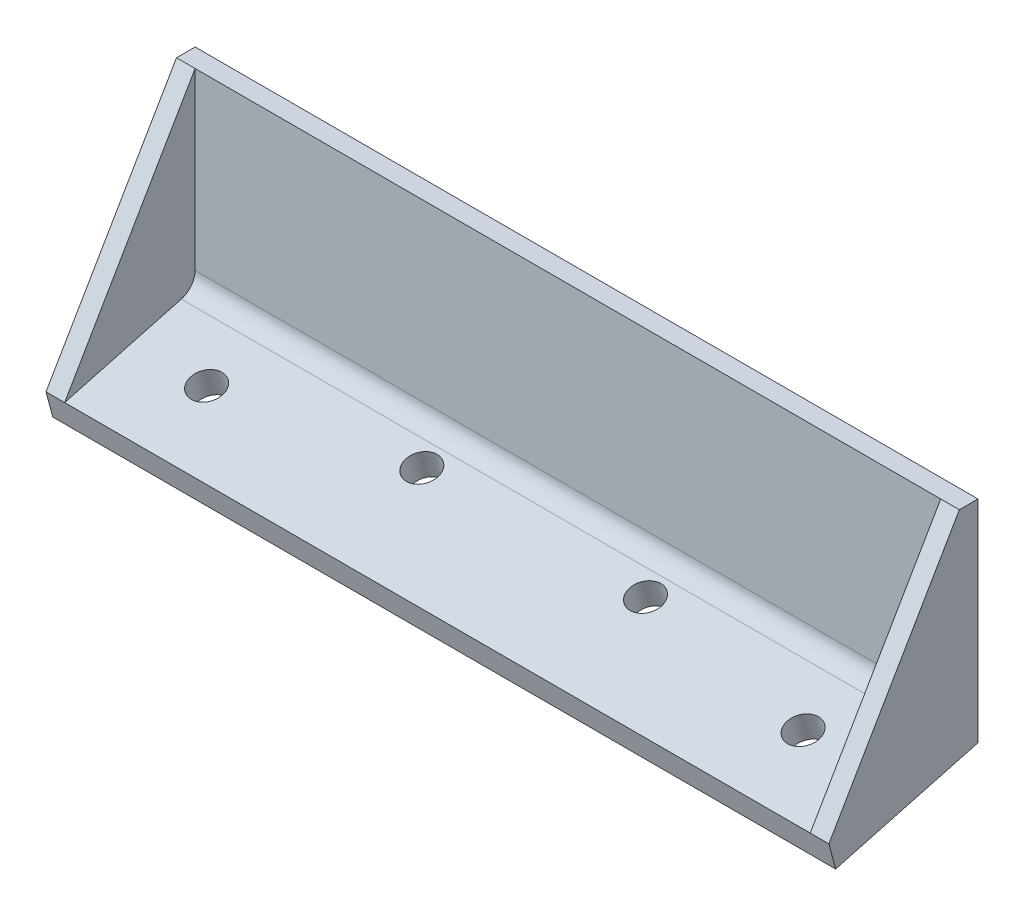
ISO-10303-21;
HEADER;
FILE_DESCRIPTION(('STEP AP214'),'2;1');
FILE_NAME('part.step','',(''),(''),'','','');
FILE_SCHEMA(('AUTOMOTIVE_DESIGN { 1 0 10303 214 1 1 1 1 }'));
ENDSEC;
DATA;
#1=APPLICATION_CONTEXT('core data for automotive mechanical design processes');
#2=APPLICATION_PROTOCOL_DEFINITION('international standard','automotive_design',2000,#1);
#3=PRODUCT_CONTEXT('',#1,'mechanical');
#4=PRODUCT('Part','Part','',(#3));
#5=PRODUCT_RELATED_PRODUCT_CATEGORY('part','',(#4));
#6=PRODUCT_DEFINITION_FORMATION('','',#4);
#7=PRODUCT_DEFINITION_CONTEXT('part definition',#1,'design');
#8=PRODUCT_DEFINITION('design','',#6,#7);
#9=PRODUCT_DEFINITION_SHAPE('','',#8);
#10=(LENGTH_UNIT() NAMED_UNIT(*) SI_UNIT(.MILLI.,.METRE.));
#11=(NAMED_UNIT(*) PLANE_ANGLE_UNIT() SI_UNIT($,.RADIAN.));
#12=(NAMED_UNIT(*) SI_UNIT($,.STERADIAN.) SOLID_ANGLE_UNIT());
#13=UNCERTAINTY_MEASURE_WITH_UNIT(LENGTH_MEASURE(1.E-05),#10,'distance_accuracy_value','');
#14=(GEOMETRIC_REPRESENTATION_CONTEXT(3) GLOBAL_UNCERTAINTY_ASSIGNED_CONTEXT((#13)) GLOBAL_UNIT_ASSIGNED_CONTEXT((#10,
#11,#12)) REPRESENTATION_CONTEXT('',''));
#15=CARTESIAN_POINT('',(0.,0.,0.));
#16=DIRECTION('',(0.,0.,1.));
#17=DIRECTION('',(1.,0.,0.));
#18=AXIS2_PLACEMENT_3D('',#15,#16,#17);
#19=CARTESIAN_POINT('',(160.,30.,-31.93));
#20=DIRECTION('',(0.,1.,0.));
#21=DIRECTION('',(0.,0.,1.));
#22=AXIS2_PLACEMENT_3D('',#19,#20,#21);
#23=PLANE('',#22);
#24=DIRECTION('',(1.,0.,0.));
#25=VECTOR('',#24,1.);
#26=CARTESIAN_POINT('',(160.,30.,52.));
#27=LINE('',#26,#25);
#28=CARTESIAN_POINT('',(-52.,30.,52.));
#29=VERTEX_POINT('',#28);
#30=CARTESIAN_POINT('',(158.,30.,52.));
#31=VERTEX_POINT('',#30);
#32=EDGE_CURVE('E118',#29,#31,#27,.T.);
#33=ORIENTED_EDGE('',*,*,#32,.F.);
#34=DIRECTION('',(0.,0.,1.));
#35=VECTOR('',#34,1.);
#36=CARTESIAN_POINT('',(-52.,30.,0.));
#37=LINE('',#36,#35);
#38=CARTESIAN_POINT('',(-52.,30.,57.));
#39=VERTEX_POINT('',#38);
#40=EDGE_CURVE('E128',#29,#39,#37,.T.);
#41=ORIENTED_EDGE('',*,*,#40,.T.);
#42=DIRECTION('',(1.,0.,0.));
#43=VECTOR('',#42,1.);
#44=CARTESIAN_POINT('',(-52.,30.,57.));
#45=LINE('',#44,#43);
#46=CARTESIAN_POINT('',(-47.,30.,57.));
#47=VERTEX_POINT('',#46);
#48=EDGE_CURVE('E181',#39,#47,#45,.T.);
#49=ORIENTED_EDGE('',*,*,#48,.T.);
#50=CARTESIAN_POINT('',(153.,30.,57.));
#51=VERTEX_POINT('',#50);
#52=EDGE_CURVE('E183',#47,#51,#45,.T.);
#53=ORIENTED_EDGE('',*,*,#52,.T.);
#54=DIRECTION('',(1.,0.,0.));
#55=VECTOR('',#54,1.);
#56=CARTESIAN_POINT('',(153.,30.,57.));
#57=LINE('',#56,#55);
#58=CARTESIAN_POINT('',(158.,30.,57.));
#59=VERTEX_POINT('',#58);
#60=EDGE_CURVE('E162',#51,#59,#57,.T.);
#61=ORIENTED_EDGE('',*,*,#60,.T.);
#62=DIRECTION('',(0.,0.,1.));
#63=VECTOR('',#62,1.);
#64=CARTESIAN_POINT('',(158.,30.,0.));
#65=LINE('',#64,#63);
#66=EDGE_CURVE('E131',#31,#59,#65,.T.);
#67=ORIENTED_EDGE('',*,*,#66,.F.);
#68=EDGE_LOOP('',(#33,#41,#49,#53,#61,#67));
#69=FACE_BOUND('',#68,.T.);
#70=ADVANCED_FACE('F43',(#69),#23,.T.);
#71=CARTESIAN_POINT('',(158.,0.,0.));
#72=DIRECTION('',(-1.,0.,0.));
#73=DIRECTION('',(0.,0.,1.));
#74=AXIS2_PLACEMENT_3D('',#71,#72,#73);
#75=PLANE('',#74);
#76=DIRECTION('',(0.,1.,0.));
#77=VECTOR('',#76,1.);
#78=CARTESIAN_POINT('',(158.,-241.069901587953,52.));
#79=LINE('',#78,#77);
#80=CARTESIAN_POINT('',(158.,-26.6354645502457,52.));
#81=VERTEX_POINT('',#80);
#82=EDGE_CURVE('E147',#81,#31,#79,.T.);
#83=ORIENTED_EDGE('',*,*,#82,.T.);
#84=ORIENTED_EDGE('',*,*,#66,.T.);
#85=DIRECTION('',(0.,-0.864167385121237,0.503204461916549));
#86=VECTOR('',#85,1.);
#87=CARTESIAN_POINT('',(158.,30.,57.));
#88=LINE('',#87,#86);
#89=CARTESIAN_POINT('',(158.,-30.10649898462,92.));
#90=VERTEX_POINT('',#89);
#91=EDGE_CURVE('E159',#59,#90,#88,.T.);
#92=ORIENTED_EDGE('',*,*,#91,.T.);
#93=DIRECTION('',(0.,-0.965925826289069,-0.258819045102518));
#94=VECTOR('',#93,1.);
#95=CARTESIAN_POINT('',(158.,-36.8679797686435,90.1882666842824));
#96=LINE('',#95,#94);
#97=CARTESIAN_POINT('',(158.,-36.8679797686435,90.1882666842824));
#98=VERTEX_POINT('',#97);
#99=EDGE_CURVE('E212',#90,#98,#96,.T.);
#100=ORIENTED_EDGE('',*,*,#99,.T.);
#101=DIRECTION('',(0.,0.258819045102521,-0.965925826289068));
#102=VECTOR('',#101,1.);
#103=CARTESIAN_POINT('',(158.,-40.9998481086648,105.608609259427));
#104=LINE('',#103,#102);
#105=EDGE_CURVE('E182',#98,#81,#104,.T.);
#106=ORIENTED_EDGE('',*,*,#105,.T.);
#107=EDGE_LOOP('',(#83,#84,#92,#100,#106));
#108=FACE_BOUND('',#107,.T.);
#109=ADVANCED_FACE('F234',(#108),#75,.F.);
#110=CARTESIAN_POINT('',(-52.,0.,0.));
#111=DIRECTION('',(-1.,0.,0.));
#112=DIRECTION('',(0.,0.,1.));
#113=AXIS2_PLACEMENT_3D('',#110,#111,#112);
#114=PLANE('',#113);
#115=ORIENTED_EDGE('',*,*,#40,.F.);
#116=DIRECTION('',(0.,1.,0.));
#117=VECTOR('',#116,1.);
#118=CARTESIAN_POINT('',(-52.,-241.069901587953,52.));
#119=LINE('',#118,#117);
#120=CARTESIAN_POINT('',(-52.,-26.6354645502457,52.));
#121=VERTEX_POINT('',#120);
#122=EDGE_CURVE('E114',#121,#29,#119,.T.);
#123=ORIENTED_EDGE('',*,*,#122,.F.);
#124=DIRECTION('',(0.,-0.258819045102521,0.965925826289068));
#125=VECTOR('',#124,1.);
#126=CARTESIAN_POINT('',(-51.9999999999999,-40.9998481086648,105.608609259427));
#127=LINE('',#126,#125);
#128=CARTESIAN_POINT('',(-52.,-36.8679797686435,90.1882666842824));
#129=VERTEX_POINT('',#128);
#130=EDGE_CURVE('E124',#121,#129,#127,.T.);
#131=ORIENTED_EDGE('',*,*,#130,.T.);
#132=DIRECTION('',(0.,0.965925826289069,0.258819045102519));
#133=VECTOR('',#132,1.);
#134=CARTESIAN_POINT('',(-52.,-36.8679797686435,90.1882666842824));
#135=LINE('',#134,#133);
#136=CARTESIAN_POINT('',(-52.,-30.10649898462,92.));
#137=VERTEX_POINT('',#136);
#138=EDGE_CURVE('E211',#129,#137,#135,.T.);
#139=ORIENTED_EDGE('',*,*,#138,.T.);
#140=DIRECTION('',(0.,0.864167385121237,-0.503204461916549));
#141=VECTOR('',#140,1.);
#142=CARTESIAN_POINT('',(-52.,30.,57.));
#143=LINE('',#142,#141);
#144=EDGE_CURVE('E137',#137,#39,#143,.T.);
#145=ORIENTED_EDGE('',*,*,#144,.T.);
#146=EDGE_LOOP('',(#115,#123,#131,#139,#145));
#147=FACE_BOUND('',#146,.T.);
#148=ADVANCED_FACE('F135',(#147),#114,.T.);
#149=CARTESIAN_POINT('',(-52.,-241.069901587953,52.));
#150=DIRECTION('',(0.,0.,-1.));
#151=DIRECTION('',(-1.,0.,0.));
#152=AXIS2_PLACEMENT_3D('',#149,#150,#151);
#153=PLANE('',#152);
#154=ORIENTED_EDGE('',*,*,#122,.T.);
#155=ORIENTED_EDGE('',*,*,#32,.T.);
#156=ORIENTED_EDGE('',*,*,#82,.F.);
#157=DIRECTION('',(-1.,0.,0.));
#158=VECTOR('',#157,1.);
#159=CARTESIAN_POINT('',(-52.,-26.6354645502457,52.));
#160=LINE('',#159,#158);
#161=EDGE_CURVE('E120',#81,#121,#160,.T.);
#162=ORIENTED_EDGE('',*,*,#161,.T.);
#163=EDGE_LOOP('',(#154,#155,#156,#162));
#164=FACE_BOUND('',#163,.T.);
#165=ADVANCED_FACE('F116',(#164),#153,.T.);
#166=CARTESIAN_POINT('',(0.,-11.8512267461792,-3.17552663595684));
#167=DIRECTION('',(0.,-0.965925826289068,-0.258819045102521));
#168=DIRECTION('',(0.,0.258819045102521,-0.965925826289068));
#169=AXIS2_PLACEMENT_3D('',#166,#167,#168);
#170=PLANE('',#169);
#171=CARTESIAN_POINT('',(-27.,-32.0226280656068,72.1051679480088));
#172=DIRECTION('',(0.,-0.965925826289068,-0.258819045102521));
#173=DIRECTION('',(0.,0.258819045102521,-0.965925826289068));
#174=AXIS2_PLACEMENT_3D('',#171,#172,#173);
#175=CIRCLE('',#174,4.25);
#176=CARTESIAN_POINT('',(-27.,-30.9226471239211,67.9999831862803));
#177=VERTEX_POINT('',#176);
#178=EDGE_CURVE('E156',#177,#177,#175,.T.);
#179=ORIENTED_EDGE('',*,*,#178,.F.);
#180=EDGE_LOOP('',(#179));
#181=FACE_BOUND('',#180,.T.);
#182=CARTESIAN_POINT('',(23.,-29.9520757047866,64.3777613376962));
#183=DIRECTION('',(0.,-0.965925826289068,-0.258819045102521));
#184=DIRECTION('',(0.,0.258819045102521,-0.965925826289068));
#185=AXIS2_PLACEMENT_3D('',#182,#183,#184);
#186=CIRCLE('',#185,4.25);
#187=CARTESIAN_POINT('',(23.,-28.8520947631009,60.2725765759677));
#188=VERTEX_POINT('',#187);
#189=EDGE_CURVE('E160',#188,#188,#186,.T.);
#190=ORIENTED_EDGE('',*,*,#189,.F.);
#191=EDGE_LOOP('',(#190));
#192=FACE_BOUND('',#191,.T.);
#193=CARTESIAN_POINT('',(83.,-29.9520757047866,64.3777613376962));
#194=DIRECTION('',(0.,-0.965925826289068,-0.258819045102521));
#195=DIRECTION('',(0.,0.258819045102521,-0.965925826289068));
#196=AXIS2_PLACEMENT_3D('',#193,#194,#195);
#197=CIRCLE('',#196,4.25);
#198=CARTESIAN_POINT('',(83.,-28.8520947631009,60.2725765759677));
#199=VERTEX_POINT('',#198);
#200=EDGE_CURVE('E246',#199,#199,#197,.T.);
#201=ORIENTED_EDGE('',*,*,#200,.F.);
#202=EDGE_LOOP('',(#201));
#203=FACE_BOUND('',#202,.T.);
#204=CARTESIAN_POINT('',(133.,-32.0226280656068,72.1051679480088));
#205=DIRECTION('',(0.,-0.965925826289068,-0.258819045102521));
#206=DIRECTION('',(0.,0.258819045102521,-0.965925826289068));
#207=AXIS2_PLACEMENT_3D('',#204,#205,#206);
#208=CIRCLE('',#207,4.25);
#209=CARTESIAN_POINT('',(133.,-30.9226471239211,67.9999831862803));
#210=VERTEX_POINT('',#209);
#211=EDGE_CURVE('E168',#210,#210,#208,.T.);
#212=ORIENTED_EDGE('',*,*,#211,.F.);
#213=EDGE_LOOP('',(#212));
#214=FACE_BOUND('',#213,.T.);
#215=ORIENTED_EDGE('',*,*,#130,.F.);
#216=ORIENTED_EDGE('',*,*,#161,.F.);
#217=ORIENTED_EDGE('',*,*,#105,.F.);
#218=DIRECTION('',(-1.,0.,0.));
#219=VECTOR('',#218,1.);
#220=CARTESIAN_POINT('',(196.54205491934,-36.8679797686435,90.1882666842824));
#221=LINE('',#220,#219);
#222=EDGE_CURVE('E219',#98,#129,#221,.T.);
#223=ORIENTED_EDGE('',*,*,#222,.T.);
#224=EDGE_LOOP('',(#215,#216,#217,#223));
#225=FACE_BOUND('',#224,.T.);
#226=ADVANCED_FACE('F301',(#181,#192,#203,#214,#225),#170,.T.);
#227=CARTESIAN_POINT('',(-52.,-241.069901587953,57.));
#228=DIRECTION('',(0.,0.,1.));
#229=DIRECTION('',(1.,0.,0.));
#230=AXIS2_PLACEMENT_3D('',#227,#228,#229);
#231=PLANE('',#230);
#232=DIRECTION('',(0.,-1.,0.));
#233=VECTOR('',#232,1.);
#234=CARTESIAN_POINT('',(-47.,-20.7282772495308,57.));
#235=LINE('',#234,#233);
#236=CARTESIAN_POINT('',(-47.,-16.891642309636,57.));
#237=VERTEX_POINT('',#236);
#238=EDGE_CURVE('E175',#47,#237,#235,.T.);
#239=ORIENTED_EDGE('',*,*,#238,.T.);
#240=DIRECTION('',(-1.,0.,0.));
#241=VECTOR('',#240,1.);
#242=CARTESIAN_POINT('',(153.,-16.891642309636,57.));
#243=LINE('',#242,#241);
#244=CARTESIAN_POINT('',(153.,-16.891642309636,57.));
#245=VERTEX_POINT('',#244);
#246=EDGE_CURVE('E52',#237,#245,#243,.F.);
#247=ORIENTED_EDGE('',*,*,#246,.T.);
#248=DIRECTION('',(0.,1.,0.));
#249=VECTOR('',#248,1.);
#250=CARTESIAN_POINT('',(153.,-20.7282772495308,57.));
#251=LINE('',#250,#249);
#252=EDGE_CURVE('E193',#245,#51,#251,.T.);
#253=ORIENTED_EDGE('',*,*,#252,.T.);
#254=ORIENTED_EDGE('',*,*,#52,.F.);
#255=EDGE_LOOP('',(#239,#247,#253,#254));
#256=FACE_BOUND('',#255,.T.);
#257=ADVANCED_FACE('F271',(#256),#231,.T.);
#258=CARTESIAN_POINT('',(196.54205491934,-30.10649898462,92.));
#259=DIRECTION('',(0.,0.965925826289069,0.258819045102519));
#260=DIRECTION('',(0.,-0.258819045102519,0.965925826289069));
#261=AXIS2_PLACEMENT_3D('',#258,#259,#260);
#262=PLANE('',#261);
#263=CARTESIAN_POINT('',(-27.,-25.2611472815833,73.9169012637264));
#264=DIRECTION('',(0.,0.965925826289069,0.258819045102519));
#265=DIRECTION('',(0.,-0.258819045102519,0.965925826289069));
#266=AXIS2_PLACEMENT_3D('',#263,#264,#265);
#267=CIRCLE('',#266,4.25);
#268=CARTESIAN_POINT('',(-27.,-26.361128223269,78.022086025455));
#269=VERTEX_POINT('',#268);
#270=EDGE_CURVE('E166',#269,#269,#267,.T.);
#271=ORIENTED_EDGE('',*,*,#270,.F.);
#272=EDGE_LOOP('',(#271));
#273=FACE_BOUND('',#272,.T.);
#274=CARTESIAN_POINT('',(23.,-23.1905949207632,66.1894946534139));
#275=DIRECTION('',(0.,0.965925826289069,0.258819045102519));
#276=DIRECTION('',(0.,-0.258819045102519,0.965925826289069));
#277=AXIS2_PLACEMENT_3D('',#274,#275,#276);
#278=CIRCLE('',#277,4.25);
#279=CARTESIAN_POINT('',(23.,-24.2905758624489,70.2946794151424));
#280=VERTEX_POINT('',#279);
#281=EDGE_CURVE('E169',#280,#280,#278,.T.);
#282=ORIENTED_EDGE('',*,*,#281,.F.);
#283=EDGE_LOOP('',(#282));
#284=FACE_BOUND('',#283,.T.);
#285=CARTESIAN_POINT('',(83.,-23.1905949207632,66.1894946534139));
#286=DIRECTION('',(0.,0.965925826289069,0.258819045102519));
#287=DIRECTION('',(0.,-0.258819045102519,0.965925826289069));
#288=AXIS2_PLACEMENT_3D('',#285,#286,#287);
#289=CIRCLE('',#288,4.25);
#290=CARTESIAN_POINT('',(83.,-24.2905758624489,70.2946794151424));
#291=VERTEX_POINT('',#290);
#292=EDGE_CURVE('E177',#291,#291,#289,.T.);
#293=ORIENTED_EDGE('',*,*,#292,.F.);
#294=EDGE_LOOP('',(#293));
#295=FACE_BOUND('',#294,.T.);
#296=CARTESIAN_POINT('',(133.,-25.2611472815833,73.9169012637264));
#297=DIRECTION('',(0.,0.965925826289069,0.258819045102519));
#298=DIRECTION('',(0.,-0.258819045102519,0.965925826289069));
#299=AXIS2_PLACEMENT_3D('',#296,#297,#298);
#300=CIRCLE('',#299,4.25);
#301=CARTESIAN_POINT('',(133.,-26.361128223269,78.022086025455));
#302=VERTEX_POINT('',#301);
#303=EDGE_CURVE('E132',#302,#302,#300,.T.);
#304=ORIENTED_EDGE('',*,*,#303,.F.);
#305=EDGE_LOOP('',(#304));
#306=FACE_BOUND('',#305,.T.);
#307=DIRECTION('',(0.,0.258819045102519,-0.965925826289069));
#308=VECTOR('',#307,1.);
#309=CARTESIAN_POINT('',(153.,-30.10649898462,92.));
#310=LINE('',#309,#308);
#311=CARTESIAN_POINT('',(153.,-30.10649898462,92.));
#312=VERTEX_POINT('',#311);
#313=CARTESIAN_POINT('',(153.,-21.7212714410813,60.7059047744874));
#314=VERTEX_POINT('',#313);
#315=EDGE_CURVE('E163',#312,#314,#310,.T.);
#316=ORIENTED_EDGE('',*,*,#315,.T.);
#317=DIRECTION('',(-1.,0.,0.));
#318=VECTOR('',#317,1.);
#319=CARTESIAN_POINT('',(-47.,-21.7212714410813,60.7059047744874));
#320=LINE('',#319,#318);
#321=CARTESIAN_POINT('',(-47.,-21.7212714410813,60.7059047744874));
#322=VERTEX_POINT('',#321);
#323=EDGE_CURVE('E142',#314,#322,#320,.T.);
#324=ORIENTED_EDGE('',*,*,#323,.T.);
#325=DIRECTION('',(0.,-0.258819045102519,0.965925826289069));
#326=VECTOR('',#325,1.);
#327=CARTESIAN_POINT('',(-47.,-30.10649898462,92.));
#328=LINE('',#327,#326);
#329=CARTESIAN_POINT('',(-47.,-30.10649898462,92.));
#330=VERTEX_POINT('',#329);
#331=EDGE_CURVE('E172',#322,#330,#328,.T.);
#332=ORIENTED_EDGE('',*,*,#331,.T.);
#333=DIRECTION('',(-1.,0.,0.));
#334=VECTOR('',#333,1.);
#335=CARTESIAN_POINT('',(196.54205491934,-30.10649898462,92.));
#336=LINE('',#335,#334);
#337=EDGE_CURVE('E223',#312,#330,#336,.T.);
#338=ORIENTED_EDGE('',*,*,#337,.F.);
#339=EDGE_LOOP('',(#316,#324,#332,#338));
#340=FACE_BOUND('',#339,.T.);
#341=ADVANCED_FACE('F267',(#273,#284,#295,#306,#340),#262,.T.);
#342=CARTESIAN_POINT('',(196.54205491934,-36.8679797686435,90.1882666842824));
#343=DIRECTION('',(0.,-0.258819045102518,0.965925826289069));
#344=DIRECTION('',(0.,-0.965925826289069,-0.258819045102518));
#345=AXIS2_PLACEMENT_3D('',#342,#343,#344);
#346=PLANE('',#345);
#347=ORIENTED_EDGE('',*,*,#99,.F.);
#348=EDGE_CURVE('E216',#90,#312,#336,.T.);
#349=ORIENTED_EDGE('',*,*,#348,.T.);
#350=ORIENTED_EDGE('',*,*,#337,.T.);
#351=DIRECTION('',(-1.,0.,0.));
#352=VECTOR('',#351,1.);
#353=CARTESIAN_POINT('',(-47.,-30.10649898462,92.));
#354=LINE('',#353,#352);
#355=EDGE_CURVE('E174',#330,#137,#354,.T.);
#356=ORIENTED_EDGE('',*,*,#355,.T.);
#357=ORIENTED_EDGE('',*,*,#138,.F.);
#358=ORIENTED_EDGE('',*,*,#222,.F.);
#359=EDGE_LOOP('',(#347,#349,#350,#356,#357,#358));
#360=FACE_BOUND('',#359,.T.);
#361=ADVANCED_FACE('F270',(#360),#346,.T.);
#362=CARTESIAN_POINT('',(-47.,30.,57.));
#363=DIRECTION('',(0.,0.503204461916549,0.864167385121237));
#364=DIRECTION('',(0.,-0.864167385121237,0.503204461916549));
#365=AXIS2_PLACEMENT_3D('',#362,#363,#364);
#366=PLANE('',#365);
#367=ORIENTED_EDGE('',*,*,#144,.F.);
#368=ORIENTED_EDGE('',*,*,#355,.F.);
#369=DIRECTION('',(0.,0.864167385121237,-0.503204461916549));
#370=VECTOR('',#369,1.);
#371=CARTESIAN_POINT('',(-47.,30.,57.));
#372=LINE('',#371,#370);
#373=EDGE_CURVE('E200',#330,#47,#372,.T.);
#374=ORIENTED_EDGE('',*,*,#373,.T.);
#375=ORIENTED_EDGE('',*,*,#48,.F.);
#376=EDGE_LOOP('',(#367,#368,#374,#375));
#377=FACE_BOUND('',#376,.T.);
#378=ADVANCED_FACE('F310',(#377),#366,.T.);
#379=CARTESIAN_POINT('',(-47.,0.,0.));
#380=DIRECTION('',(1.,0.,0.));
#381=DIRECTION('',(0.,0.,-1.));
#382=AXIS2_PLACEMENT_3D('',#379,#380,#381);
#383=PLANE('',#382);
#384=ORIENTED_EDGE('',*,*,#331,.F.);
#385=CARTESIAN_POINT('',(-47.,-16.891642309636,62.));
#386=DIRECTION('',(1.,0.,0.));
#387=DIRECTION('',(0.,0.,-1.));
#388=AXIS2_PLACEMENT_3D('',#385,#386,#387);
#389=CIRCLE('',#388,5.);
#390=EDGE_CURVE('E66',#322,#237,#389,.T.);
#391=ORIENTED_EDGE('',*,*,#390,.T.);
#392=ORIENTED_EDGE('',*,*,#238,.F.);
#393=ORIENTED_EDGE('',*,*,#373,.F.);
#394=EDGE_LOOP('',(#384,#391,#392,#393));
#395=FACE_BOUND('',#394,.T.);
#396=ADVANCED_FACE('F315',(#395),#383,.T.);
#397=CARTESIAN_POINT('',(153.,30.,57.));
#398=DIRECTION('',(0.,0.503204461916549,0.864167385121237));
#399=DIRECTION('',(0.,-0.864167385121237,0.503204461916549));
#400=AXIS2_PLACEMENT_3D('',#397,#398,#399);
#401=PLANE('',#400);
#402=ORIENTED_EDGE('',*,*,#91,.F.);
#403=ORIENTED_EDGE('',*,*,#60,.F.);
#404=DIRECTION('',(0.,-0.864167385121237,0.503204461916549));
#405=VECTOR('',#404,1.);
#406=CARTESIAN_POINT('',(153.,30.,57.));
#407=LINE('',#406,#405);
#408=EDGE_CURVE('E186',#51,#312,#407,.T.);
#409=ORIENTED_EDGE('',*,*,#408,.T.);
#410=ORIENTED_EDGE('',*,*,#348,.F.);
#411=EDGE_LOOP('',(#402,#403,#409,#410));
#412=FACE_BOUND('',#411,.T.);
#413=ADVANCED_FACE('F239',(#412),#401,.T.);
#414=CARTESIAN_POINT('',(153.,0.,0.));
#415=DIRECTION('',(-1.,0.,0.));
#416=DIRECTION('',(0.,0.,1.));
#417=AXIS2_PLACEMENT_3D('',#414,#415,#416);
#418=PLANE('',#417);
#419=ORIENTED_EDGE('',*,*,#252,.F.);
#420=CARTESIAN_POINT('',(153.,-16.891642309636,62.));
#421=DIRECTION('',(-1.,0.,0.));
#422=DIRECTION('',(0.,0.,1.));
#423=AXIS2_PLACEMENT_3D('',#420,#421,#422);
#424=CIRCLE('',#423,5.);
#425=EDGE_CURVE('E11',#245,#314,#424,.T.);
#426=ORIENTED_EDGE('',*,*,#425,.T.);
#427=ORIENTED_EDGE('',*,*,#315,.F.);
#428=ORIENTED_EDGE('',*,*,#408,.F.);
#429=EDGE_LOOP('',(#419,#426,#427,#428));
#430=FACE_BOUND('',#429,.T.);
#431=ADVANCED_FACE('F281',(#430),#418,.T.);
#432=CARTESIAN_POINT('',(133.,-78.3196947366772,59.6999063215657));
#433=DIRECTION('',(0.,0.965925826289069,0.25881904510252));
#434=DIRECTION('',(0.,-0.25881904510252,0.965925826289069));
#435=AXIS2_PLACEMENT_3D('',#432,#433,#434);
#436=CYLINDRICAL_SURFACE('',#435,4.25);
#437=ORIENTED_EDGE('',*,*,#211,.T.);
#438=EDGE_LOOP('',(#437));
#439=FACE_BOUND('',#438,.T.);
#440=ORIENTED_EDGE('',*,*,#303,.T.);
#441=EDGE_LOOP('',(#440));
#442=FACE_BOUND('',#441,.T.);
#443=ADVANCED_FACE('F278',(#439,#442),#436,.F.);
#444=CARTESIAN_POINT('',(83.,-76.249142375857,51.9724997112532));
#445=DIRECTION('',(0.,0.965925826289069,0.25881904510252));
#446=DIRECTION('',(0.,-0.25881904510252,0.965925826289069));
#447=AXIS2_PLACEMENT_3D('',#444,#445,#446);
#448=CYLINDRICAL_SURFACE('',#447,4.25);
#449=ORIENTED_EDGE('',*,*,#200,.T.);
#450=EDGE_LOOP('',(#449));
#451=FACE_BOUND('',#450,.T.);
#452=ORIENTED_EDGE('',*,*,#292,.T.);
#453=EDGE_LOOP('',(#452));
#454=FACE_BOUND('',#453,.T.);
#455=ADVANCED_FACE('F280',(#451,#454),#448,.F.);
#456=CARTESIAN_POINT('',(23.,-76.249142375857,51.9724997112532));
#457=DIRECTION('',(0.,0.965925826289069,0.25881904510252));
#458=DIRECTION('',(0.,-0.25881904510252,0.965925826289069));
#459=AXIS2_PLACEMENT_3D('',#456,#457,#458);
#460=CYLINDRICAL_SURFACE('',#459,4.25);
#461=ORIENTED_EDGE('',*,*,#189,.T.);
#462=EDGE_LOOP('',(#461));
#463=FACE_BOUND('',#462,.T.);
#464=ORIENTED_EDGE('',*,*,#281,.T.);
#465=EDGE_LOOP('',(#464));
#466=FACE_BOUND('',#465,.T.);
#467=ADVANCED_FACE('F265',(#463,#466),#460,.F.);
#468=CARTESIAN_POINT('',(-27.,-78.3196947366772,59.6999063215657));
#469=DIRECTION('',(0.,0.965925826289069,0.25881904510252));
#470=DIRECTION('',(0.,-0.25881904510252,0.965925826289069));
#471=AXIS2_PLACEMENT_3D('',#468,#469,#470);
#472=CYLINDRICAL_SURFACE('',#471,4.25);
#473=ORIENTED_EDGE('',*,*,#178,.T.);
#474=EDGE_LOOP('',(#473));
#475=FACE_BOUND('',#474,.T.);
#476=ORIENTED_EDGE('',*,*,#270,.T.);
#477=EDGE_LOOP('',(#476));
#478=FACE_BOUND('',#477,.T.);
#479=ADVANCED_FACE('F344',(#475,#478),#472,.F.);
#480=CARTESIAN_POINT('',(196.54205491934,-16.891642309636,62.));
#481=DIRECTION('',(1.,0.,0.));
#482=DIRECTION('',(0.,0.,-1.));
#483=AXIS2_PLACEMENT_3D('',#480,#481,#482);
#484=CYLINDRICAL_SURFACE('',#483,5.);
#485=ORIENTED_EDGE('',*,*,#425,.F.);
#486=ORIENTED_EDGE('',*,*,#246,.F.);
#487=ORIENTED_EDGE('',*,*,#390,.F.);
#488=ORIENTED_EDGE('',*,*,#323,.F.);
#489=EDGE_LOOP('',(#485,#486,#487,#488));
#490=FACE_BOUND('',#489,.T.);
#491=ADVANCED_FACE('F45',(#490),#484,.F.);
#492=CLOSED_SHELL('',(#70,#109,#148,#165,#226,#257,#341,#361,#378,#396,#413,#431,#443,#455,#467,
#479,#491));
#493=MANIFOLD_SOLID_BREP('B2',#492);
#494=ADVANCED_BREP_SHAPE_REPRESENTATION('',(#18,#493),#14);
#495=SHAPE_DEFINITION_REPRESENTATION(#9,#494);
ENDSEC;
END-ISO-10303-21;
